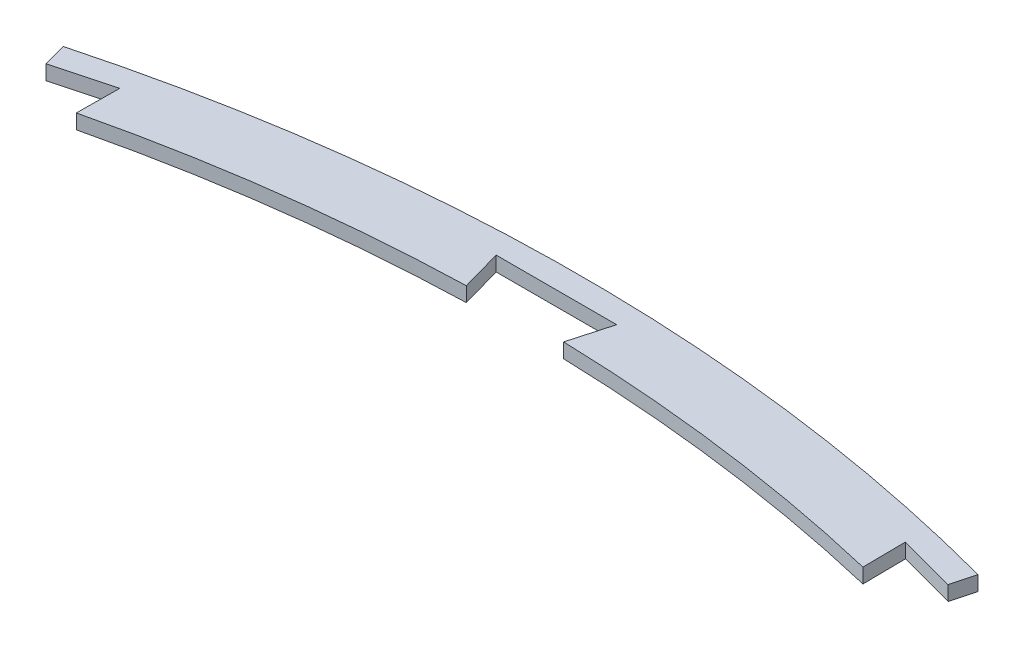
ISO-10303-21;
HEADER;
FILE_DESCRIPTION(('STEP AP214'),'2;1');
FILE_NAME('part.step','',(''),(''),'','','');
FILE_SCHEMA(('AUTOMOTIVE_DESIGN { 1 0 10303 214 1 1 1 1 }'));
ENDSEC;
DATA;
#1=APPLICATION_CONTEXT('core data for automotive mechanical design processes');
#2=APPLICATION_PROTOCOL_DEFINITION('international standard','automotive_design',2000,#1);
#3=PRODUCT_CONTEXT('',#1,'mechanical');
#4=PRODUCT('Part','Part','',(#3));
#5=PRODUCT_RELATED_PRODUCT_CATEGORY('part','',(#4));
#6=PRODUCT_DEFINITION_FORMATION('','',#4);
#7=PRODUCT_DEFINITION_CONTEXT('part definition',#1,'design');
#8=PRODUCT_DEFINITION('design','',#6,#7);
#9=PRODUCT_DEFINITION_SHAPE('','',#8);
#10=(LENGTH_UNIT() NAMED_UNIT(*) SI_UNIT(.MILLI.,.METRE.));
#11=(NAMED_UNIT(*) PLANE_ANGLE_UNIT() SI_UNIT($,.RADIAN.));
#12=(NAMED_UNIT(*) SI_UNIT($,.STERADIAN.) SOLID_ANGLE_UNIT());
#13=UNCERTAINTY_MEASURE_WITH_UNIT(LENGTH_MEASURE(1.E-05),#10,'distance_accuracy_value','');
#14=(GEOMETRIC_REPRESENTATION_CONTEXT(3) GLOBAL_UNCERTAINTY_ASSIGNED_CONTEXT((#13)) GLOBAL_UNIT_ASSIGNED_CONTEXT((#10,
#11,#12)) REPRESENTATION_CONTEXT('',''));
#15=CARTESIAN_POINT('',(0.,0.,0.));
#16=DIRECTION('',(0.,0.,1.));
#17=DIRECTION('',(1.,0.,0.));
#18=AXIS2_PLACEMENT_3D('',#15,#16,#17);
#19=CARTESIAN_POINT('',(0.,9.00000000000001,0.));
#20=DIRECTION('',(0.,-1.,0.));
#21=DIRECTION('',(0.,0.,-1.));
#22=AXIS2_PLACEMENT_3D('',#19,#20,#21);
#23=CYLINDRICAL_SURFACE('',#22,1045.);
#24=CARTESIAN_POINT('',(0.,0.,0.));
#25=DIRECTION('',(0.,1.,0.));
#26=DIRECTION('',(0.,0.,1.));
#27=AXIS2_PLACEMENT_3D('',#24,#25,#26);
#28=CIRCLE('',#27,1045.);
#29=CARTESIAN_POINT('',(241.493100980909,0.,-1016.71337267621));
#30=VERTEX_POINT('',#29);
#31=CARTESIAN_POINT('',(29.8803611509176,0.,-1044.57271839613));
#32=VERTEX_POINT('',#31);
#33=EDGE_CURVE('E176',#30,#32,#28,.T.);
#34=ORIENTED_EDGE('',*,*,#33,.F.);
#35=DIRECTION('',(0.,-1.,0.));
#36=VECTOR('',#35,1.);
#37=CARTESIAN_POINT('',(241.493100980909,9.00000000000001,-1016.71337267621));
#38=LINE('',#37,#36);
#39=CARTESIAN_POINT('',(241.493100980909,9.00000000000001,-1016.71337267621));
#40=VERTEX_POINT('',#39);
#41=EDGE_CURVE('E11',#40,#30,#38,.T.);
#42=ORIENTED_EDGE('',*,*,#41,.F.);
#43=CARTESIAN_POINT('',(0.,9.00000000000001,0.));
#44=DIRECTION('',(0.,1.,0.));
#45=DIRECTION('',(0.,0.,1.));
#46=AXIS2_PLACEMENT_3D('',#43,#44,#45);
#47=CIRCLE('',#46,1045.);
#48=CARTESIAN_POINT('',(29.8803611509176,9.00000000000001,-1044.57271839613));
#49=VERTEX_POINT('',#48);
#50=EDGE_CURVE('E170',#40,#49,#47,.T.);
#51=ORIENTED_EDGE('',*,*,#50,.T.);
#52=DIRECTION('',(0.,-1.,0.));
#53=VECTOR('',#52,1.);
#54=CARTESIAN_POINT('',(29.8803611509176,9.00000000000001,-1044.57271839613));
#55=LINE('',#54,#53);
#56=EDGE_CURVE('E113',#49,#32,#55,.T.);
#57=ORIENTED_EDGE('',*,*,#56,.T.);
#58=EDGE_LOOP('',(#34,#42,#51,#57));
#59=FACE_BOUND('',#58,.T.);
#60=ADVANCED_FACE('F49',(#59),#23,.F.);
#61=CARTESIAN_POINT('',(252.85846507014,9.00000000000001,-2.83448897572192));
#62=DIRECTION('',(0.999937176283208,0.,-0.0112090805494807));
#63=DIRECTION('',(-0.0112090805494807,0.,-0.999937176283208));
#64=AXIS2_PLACEMENT_3D('',#61,#62,#63);
#65=PLANE('',#64);
#66=DIRECTION('',(0.0112090805494807,0.,0.999937176283208));
#67=VECTOR('',#66,1.);
#68=CARTESIAN_POINT('',(252.85846507014,0.,-2.83448897572192));
#69=LINE('',#68,#67);
#70=CARTESIAN_POINT('',(241.197122686995,0.,-1043.1169387981));
#71=VERTEX_POINT('',#70);
#72=EDGE_CURVE('E180',#71,#30,#69,.T.);
#73=ORIENTED_EDGE('',*,*,#72,.F.);
#74=DIRECTION('',(0.,-1.,0.));
#75=VECTOR('',#74,1.);
#76=CARTESIAN_POINT('',(241.197122686995,9.00000000000001,-1043.1169387981));
#77=LINE('',#76,#75);
#78=CARTESIAN_POINT('',(241.197122686995,9.00000000000001,-1043.1169387981));
#79=VERTEX_POINT('',#78);
#80=EDGE_CURVE('E59',#79,#71,#77,.T.);
#81=ORIENTED_EDGE('',*,*,#80,.F.);
#82=DIRECTION('',(0.0112090805494807,0.,0.999937176283208));
#83=VECTOR('',#82,1.);
#84=CARTESIAN_POINT('',(252.85846507014,9.00000000000001,-2.83448897572192));
#85=LINE('',#84,#83);
#86=EDGE_CURVE('E297',#79,#40,#85,.T.);
#87=ORIENTED_EDGE('',*,*,#86,.T.);
#88=ORIENTED_EDGE('',*,*,#41,.T.);
#89=EDGE_LOOP('',(#73,#81,#87,#88));
#90=FACE_BOUND('',#89,.T.);
#91=ADVANCED_FACE('F51',(#90),#65,.T.);
#92=CARTESIAN_POINT('',(276.936378259693,9.00000000000001,-1033.5406341293));
#93=DIRECTION('',(-0.258819045102516,0.,0.965925826289069));
#94=DIRECTION('',(0.965925826289069,0.,0.258819045102516));
#95=AXIS2_PLACEMENT_3D('',#92,#93,#94);
#96=PLANE('',#95);
#97=DIRECTION('',(-0.965925826289069,0.,-0.258819045102516));
#98=VECTOR('',#97,1.);
#99=CARTESIAN_POINT('',(276.936378259693,0.,-1033.5406341293));
#100=LINE('',#99,#98);
#101=CARTESIAN_POINT('',(276.936378259691,0.,-1033.5406341293));
#102=VERTEX_POINT('',#101);
#103=EDGE_CURVE('E185',#102,#71,#100,.T.);
#104=ORIENTED_EDGE('',*,*,#103,.F.);
#105=DIRECTION('',(0.,-1.,0.));
#106=VECTOR('',#105,1.);
#107=CARTESIAN_POINT('',(276.936378259691,9.00000000000001,-1033.5406341293));
#108=LINE('',#107,#106);
#109=CARTESIAN_POINT('',(276.936378259691,9.00000000000001,-1033.5406341293));
#110=VERTEX_POINT('',#109);
#111=EDGE_CURVE('E237',#110,#102,#108,.T.);
#112=ORIENTED_EDGE('',*,*,#111,.F.);
#113=DIRECTION('',(-0.965925826289069,0.,-0.258819045102516));
#114=VECTOR('',#113,1.);
#115=CARTESIAN_POINT('',(276.936378259693,9.00000000000001,-1033.5406341293));
#116=LINE('',#115,#114);
#117=EDGE_CURVE('E247',#110,#79,#116,.T.);
#118=ORIENTED_EDGE('',*,*,#117,.T.);
#119=ORIENTED_EDGE('',*,*,#80,.T.);
#120=EDGE_LOOP('',(#104,#112,#118,#119));
#121=FACE_BOUND('',#120,.T.);
#122=ADVANCED_FACE('F245',(#121),#96,.T.);
#123=CARTESIAN_POINT('',(0.,9.00000000000001,0.));
#124=DIRECTION('',(-0.96592582628907,0.,-0.258819045102515));
#125=DIRECTION('',(-0.258819045102515,0.,0.96592582628907));
#126=AXIS2_PLACEMENT_3D('',#123,#124,#125);
#127=PLANE('',#126);
#128=DIRECTION('',(0.258819045102515,0.,-0.96592582628907));
#129=VECTOR('',#128,1.);
#130=CARTESIAN_POINT('',(0.,0.,0.));
#131=LINE('',#130,#129);
#132=CARTESIAN_POINT('',(280.818663936228,0.,-1048.02952152364));
#133=VERTEX_POINT('',#132);
#134=EDGE_CURVE('E189',#102,#133,#131,.T.);
#135=ORIENTED_EDGE('',*,*,#134,.T.);
#136=DIRECTION('',(0.,-1.,0.));
#137=VECTOR('',#136,1.);
#138=CARTESIAN_POINT('',(280.818663936228,9.00000000000001,-1048.02952152364));
#139=LINE('',#138,#137);
#140=CARTESIAN_POINT('',(280.818663936228,9.00000000000001,-1048.02952152364));
#141=VERTEX_POINT('',#140);
#142=EDGE_CURVE('E233',#141,#133,#139,.T.);
#143=ORIENTED_EDGE('',*,*,#142,.F.);
#144=DIRECTION('',(0.258819045102515,0.,-0.96592582628907));
#145=VECTOR('',#144,1.);
#146=CARTESIAN_POINT('',(0.,9.00000000000001,0.));
#147=LINE('',#146,#145);
#148=EDGE_CURVE('E268',#110,#141,#147,.T.);
#149=ORIENTED_EDGE('',*,*,#148,.F.);
#150=ORIENTED_EDGE('',*,*,#111,.T.);
#151=EDGE_LOOP('',(#135,#143,#149,#150));
#152=FACE_BOUND('',#151,.T.);
#153=ADVANCED_FACE('F257',(#152),#127,.F.);
#154=CARTESIAN_POINT('',(0.,9.00000000000001,0.));
#155=DIRECTION('',(0.,-1.,0.));
#156=DIRECTION('',(0.,0.,-1.));
#157=AXIS2_PLACEMENT_3D('',#154,#155,#156);
#158=CYLINDRICAL_SURFACE('',#157,1085.);
#159=CARTESIAN_POINT('',(0.,0.,0.));
#160=DIRECTION('',(0.,1.,0.));
#161=DIRECTION('',(0.,0.,1.));
#162=AXIS2_PLACEMENT_3D('',#159,#160,#161);
#163=CIRCLE('',#162,1085.);
#164=CARTESIAN_POINT('',(-280.818663936228,0.,-1048.02952152364));
#165=VERTEX_POINT('',#164);
#166=EDGE_CURVE('E192',#133,#165,#163,.T.);
#167=ORIENTED_EDGE('',*,*,#166,.T.);
#168=DIRECTION('',(0.,-1.,0.));
#169=VECTOR('',#168,1.);
#170=CARTESIAN_POINT('',(-280.818663936228,9.00000000000001,-1048.02952152364));
#171=LINE('',#170,#169);
#172=CARTESIAN_POINT('',(-280.818663936228,9.00000000000001,-1048.02952152364));
#173=VERTEX_POINT('',#172);
#174=EDGE_CURVE('E230',#173,#165,#171,.T.);
#175=ORIENTED_EDGE('',*,*,#174,.F.);
#176=CARTESIAN_POINT('',(0.,9.00000000000001,0.));
#177=DIRECTION('',(0.,1.,0.));
#178=DIRECTION('',(0.,0.,1.));
#179=AXIS2_PLACEMENT_3D('',#176,#177,#178);
#180=CIRCLE('',#179,1085.);
#181=EDGE_CURVE('E263',#141,#173,#180,.T.);
#182=ORIENTED_EDGE('',*,*,#181,.F.);
#183=ORIENTED_EDGE('',*,*,#142,.T.);
#184=EDGE_LOOP('',(#167,#175,#182,#183));
#185=FACE_BOUND('',#184,.T.);
#186=ADVANCED_FACE('F261',(#185),#158,.T.);
#187=CARTESIAN_POINT('',(0.,9.00000000000001,0.));
#188=DIRECTION('',(-0.96592582628907,0.,0.258819045102515));
#189=DIRECTION('',(0.258819045102515,0.,0.96592582628907));
#190=AXIS2_PLACEMENT_3D('',#187,#188,#189);
#191=PLANE('',#190);
#192=DIRECTION('',(-0.258819045102515,0.,-0.96592582628907));
#193=VECTOR('',#192,1.);
#194=CARTESIAN_POINT('',(0.,0.,0.));
#195=LINE('',#194,#193);
#196=CARTESIAN_POINT('',(-276.936378259691,0.,-1033.5406341293));
#197=VERTEX_POINT('',#196);
#198=EDGE_CURVE('E196',#197,#165,#195,.T.);
#199=ORIENTED_EDGE('',*,*,#198,.F.);
#200=DIRECTION('',(0.,-1.,0.));
#201=VECTOR('',#200,1.);
#202=CARTESIAN_POINT('',(-276.936378259691,9.00000000000001,-1033.5406341293));
#203=LINE('',#202,#201);
#204=CARTESIAN_POINT('',(-276.936378259691,9.00000000000001,-1033.5406341293));
#205=VERTEX_POINT('',#204);
#206=EDGE_CURVE('E227',#205,#197,#203,.T.);
#207=ORIENTED_EDGE('',*,*,#206,.F.);
#208=DIRECTION('',(-0.258819045102515,0.,-0.96592582628907));
#209=VECTOR('',#208,1.);
#210=CARTESIAN_POINT('',(0.,9.00000000000001,0.));
#211=LINE('',#210,#209);
#212=EDGE_CURVE('E267',#205,#173,#211,.T.);
#213=ORIENTED_EDGE('',*,*,#212,.T.);
#214=ORIENTED_EDGE('',*,*,#174,.T.);
#215=EDGE_LOOP('',(#199,#207,#213,#214));
#216=FACE_BOUND('',#215,.T.);
#217=ADVANCED_FACE('F333',(#216),#191,.T.);
#218=CARTESIAN_POINT('',(-276.936378259693,9.00000000000001,-1033.5406341293));
#219=DIRECTION('',(-0.258819045102517,0.,-0.965925826289069));
#220=DIRECTION('',(-0.96592582628907,0.,0.258819045102517));
#221=AXIS2_PLACEMENT_3D('',#218,#219,#220);
#222=PLANE('',#221);
#223=DIRECTION('',(0.965925826289069,0.,-0.258819045102517));
#224=VECTOR('',#223,1.);
#225=CARTESIAN_POINT('',(-276.936378259693,0.,-1033.5406341293));
#226=LINE('',#225,#224);
#227=CARTESIAN_POINT('',(-241.197122686995,0.,-1043.1169387981));
#228=VERTEX_POINT('',#227);
#229=EDGE_CURVE('E200',#197,#228,#226,.T.);
#230=ORIENTED_EDGE('',*,*,#229,.T.);
#231=DIRECTION('',(0.,-1.,0.));
#232=VECTOR('',#231,1.);
#233=CARTESIAN_POINT('',(-241.197122686995,9.00000000000001,-1043.1169387981));
#234=LINE('',#233,#232);
#235=CARTESIAN_POINT('',(-241.197122686995,9.00000000000001,-1043.1169387981));
#236=VERTEX_POINT('',#235);
#237=EDGE_CURVE('E223',#236,#228,#234,.T.);
#238=ORIENTED_EDGE('',*,*,#237,.F.);
#239=DIRECTION('',(0.965925826289069,0.,-0.258819045102517));
#240=VECTOR('',#239,1.);
#241=CARTESIAN_POINT('',(-276.936378259693,9.00000000000001,-1033.5406341293));
#242=LINE('',#241,#240);
#243=EDGE_CURVE('E273',#205,#236,#242,.T.);
#244=ORIENTED_EDGE('',*,*,#243,.F.);
#245=ORIENTED_EDGE('',*,*,#206,.T.);
#246=EDGE_LOOP('',(#230,#238,#244,#245));
#247=FACE_BOUND('',#246,.T.);
#248=ADVANCED_FACE('F329',(#247),#222,.F.);
#249=CARTESIAN_POINT('',(-252.858465070295,9.00000000000001,-2.83448897576233));
#250=DIRECTION('',(0.999937176283206,0.,0.0112090805496334));
#251=DIRECTION('',(0.0112090805496334,0.,-0.999937176283206));
#252=AXIS2_PLACEMENT_3D('',#249,#250,#251);
#253=PLANE('',#252);
#254=DIRECTION('',(-0.0112090805496334,0.,0.999937176283206));
#255=VECTOR('',#254,1.);
#256=CARTESIAN_POINT('',(-252.858465070295,0.,-2.83448897576233));
#257=LINE('',#256,#255);
#258=CARTESIAN_POINT('',(-241.493100980909,0.,-1016.71337267621));
#259=VERTEX_POINT('',#258);
#260=EDGE_CURVE('E203',#228,#259,#257,.T.);
#261=ORIENTED_EDGE('',*,*,#260,.T.);
#262=DIRECTION('',(0.,-1.,0.));
#263=VECTOR('',#262,1.);
#264=CARTESIAN_POINT('',(-241.493100980909,9.00000000000001,-1016.71337267621));
#265=LINE('',#264,#263);
#266=CARTESIAN_POINT('',(-241.493100980909,9.00000000000001,-1016.71337267621));
#267=VERTEX_POINT('',#266);
#268=EDGE_CURVE('E220',#267,#259,#265,.T.);
#269=ORIENTED_EDGE('',*,*,#268,.F.);
#270=DIRECTION('',(-0.0112090805496334,0.,0.999937176283206));
#271=VECTOR('',#270,1.);
#272=CARTESIAN_POINT('',(-252.858465070295,9.00000000000001,-2.83448897576233));
#273=LINE('',#272,#271);
#274=EDGE_CURVE('E168',#236,#267,#273,.T.);
#275=ORIENTED_EDGE('',*,*,#274,.F.);
#276=ORIENTED_EDGE('',*,*,#237,.T.);
#277=EDGE_LOOP('',(#261,#269,#275,#276));
#278=FACE_BOUND('',#277,.T.);
#279=ADVANCED_FACE('F286',(#278),#253,.F.);
#280=CARTESIAN_POINT('',(-29.8803611509177,0.,-1044.57271839614));
#281=VERTEX_POINT('',#280);
#282=EDGE_CURVE('E181',#281,#259,#28,.T.);
#283=ORIENTED_EDGE('',*,*,#282,.F.);
#284=DIRECTION('',(0.,-1.,0.));
#285=VECTOR('',#284,1.);
#286=CARTESIAN_POINT('',(-29.8803611509177,9.00000000000001,-1044.57271839614));
#287=LINE('',#286,#285);
#288=CARTESIAN_POINT('',(-29.8803611509177,9.00000000000001,-1044.57271839614));
#289=VERTEX_POINT('',#288);
#290=EDGE_CURVE('E153',#289,#281,#287,.T.);
#291=ORIENTED_EDGE('',*,*,#290,.F.);
#292=EDGE_CURVE('E163',#289,#267,#47,.T.);
#293=ORIENTED_EDGE('',*,*,#292,.T.);
#294=ORIENTED_EDGE('',*,*,#268,.T.);
#295=EDGE_LOOP('',(#283,#291,#293,#294));
#296=FACE_BOUND('',#295,.T.);
#297=ADVANCED_FACE('F291',(#296),#23,.F.);
#298=CARTESIAN_POINT('',(243.508902077206,9.00000000000001,-68.1824925816335));
#299=DIRECTION('',(0.962964019714165,0.,-0.269629925520029));
#300=DIRECTION('',(-0.269629925520029,0.,-0.962964019714165));
#301=AXIS2_PLACEMENT_3D('',#298,#299,#300);
#302=PLANE('',#301);
#303=DIRECTION('',(0.269629925520029,0.,0.962964019714165));
#304=VECTOR('',#303,1.);
#305=CARTESIAN_POINT('',(243.508902077206,0.,-68.1824925816335));
#306=LINE('',#305,#304);
#307=CARTESIAN_POINT('',(-37.,0.,-1070.));
#308=VERTEX_POINT('',#307);
#309=EDGE_CURVE('E151',#308,#281,#306,.T.);
#310=ORIENTED_EDGE('',*,*,#309,.F.);
#311=DIRECTION('',(0.,-1.,0.));
#312=VECTOR('',#311,1.);
#313=CARTESIAN_POINT('',(-37.,9.00000000000001,-1070.));
#314=LINE('',#313,#312);
#315=CARTESIAN_POINT('',(-37.,9.00000000000001,-1070.));
#316=VERTEX_POINT('',#315);
#317=EDGE_CURVE('E145',#316,#308,#314,.T.);
#318=ORIENTED_EDGE('',*,*,#317,.F.);
#319=DIRECTION('',(0.269629925520029,0.,0.962964019714165));
#320=VECTOR('',#319,1.);
#321=CARTESIAN_POINT('',(243.508902077206,9.00000000000001,-68.1824925816335));
#322=LINE('',#321,#320);
#323=EDGE_CURVE('E149',#316,#289,#322,.T.);
#324=ORIENTED_EDGE('',*,*,#323,.T.);
#325=ORIENTED_EDGE('',*,*,#290,.T.);
#326=EDGE_LOOP('',(#310,#318,#324,#325));
#327=FACE_BOUND('',#326,.T.);
#328=ADVANCED_FACE('F147',(#327),#302,.T.);
#329=CARTESIAN_POINT('',(0.,9.00000000000001,-1070.));
#330=DIRECTION('',(0.,0.,-1.));
#331=DIRECTION('',(-1.,0.,0.));
#332=AXIS2_PLACEMENT_3D('',#329,#330,#331);
#333=PLANE('',#332);
#334=DIRECTION('',(1.,0.,0.));
#335=VECTOR('',#334,1.);
#336=CARTESIAN_POINT('',(0.,0.,-1070.));
#337=LINE('',#336,#335);
#338=CARTESIAN_POINT('',(37.,0.,-1070.));
#339=VERTEX_POINT('',#338);
#340=EDGE_CURVE('E106',#308,#339,#337,.T.);
#341=ORIENTED_EDGE('',*,*,#340,.T.);
#342=DIRECTION('',(0.,-1.,0.));
#343=VECTOR('',#342,1.);
#344=CARTESIAN_POINT('',(37.,9.00000000000001,-1070.));
#345=LINE('',#344,#343);
#346=CARTESIAN_POINT('',(37.,9.00000000000001,-1070.));
#347=VERTEX_POINT('',#346);
#348=EDGE_CURVE('E154',#347,#339,#345,.T.);
#349=ORIENTED_EDGE('',*,*,#348,.F.);
#350=DIRECTION('',(1.,0.,0.));
#351=VECTOR('',#350,1.);
#352=CARTESIAN_POINT('',(0.,9.00000000000001,-1070.));
#353=LINE('',#352,#351);
#354=EDGE_CURVE('E156',#316,#347,#353,.T.);
#355=ORIENTED_EDGE('',*,*,#354,.F.);
#356=ORIENTED_EDGE('',*,*,#317,.T.);
#357=EDGE_LOOP('',(#341,#349,#355,#356));
#358=FACE_BOUND('',#357,.T.);
#359=ADVANCED_FACE('F157',(#358),#333,.F.);
#360=CARTESIAN_POINT('',(-243.508902077152,9.00000000000001,-68.182492581603));
#361=DIRECTION('',(0.962964019714181,0.,0.269629925519972));
#362=DIRECTION('',(0.269629925519972,0.,-0.962964019714182));
#363=AXIS2_PLACEMENT_3D('',#360,#361,#362);
#364=PLANE('',#363);
#365=DIRECTION('',(-0.269629925519972,0.,0.962964019714182));
#366=VECTOR('',#365,1.);
#367=CARTESIAN_POINT('',(-243.508902077152,0.,-68.182492581603));
#368=LINE('',#367,#366);
#369=EDGE_CURVE('E211',#339,#32,#368,.T.);
#370=ORIENTED_EDGE('',*,*,#369,.T.);
#371=ORIENTED_EDGE('',*,*,#56,.F.);
#372=DIRECTION('',(-0.269629925519972,0.,0.962964019714182));
#373=VECTOR('',#372,1.);
#374=CARTESIAN_POINT('',(-243.508902077152,9.00000000000001,-68.182492581603));
#375=LINE('',#374,#373);
#376=EDGE_CURVE('E67',#347,#49,#375,.T.);
#377=ORIENTED_EDGE('',*,*,#376,.F.);
#378=ORIENTED_EDGE('',*,*,#348,.T.);
#379=EDGE_LOOP('',(#370,#371,#377,#378));
#380=FACE_BOUND('',#379,.T.);
#381=ADVANCED_FACE('F295',(#380),#364,.F.);
#382=CARTESIAN_POINT('',(0.,9.00000000000001,0.));
#383=DIRECTION('',(0.,1.,0.));
#384=DIRECTION('',(0.,0.,1.));
#385=AXIS2_PLACEMENT_3D('',#382,#383,#384);
#386=PLANE('',#385);
#387=ORIENTED_EDGE('',*,*,#50,.F.);
#388=ORIENTED_EDGE('',*,*,#86,.F.);
#389=ORIENTED_EDGE('',*,*,#117,.F.);
#390=ORIENTED_EDGE('',*,*,#148,.T.);
#391=ORIENTED_EDGE('',*,*,#181,.T.);
#392=ORIENTED_EDGE('',*,*,#212,.F.);
#393=ORIENTED_EDGE('',*,*,#243,.T.);
#394=ORIENTED_EDGE('',*,*,#274,.T.);
#395=ORIENTED_EDGE('',*,*,#292,.F.);
#396=ORIENTED_EDGE('',*,*,#323,.F.);
#397=ORIENTED_EDGE('',*,*,#354,.T.);
#398=ORIENTED_EDGE('',*,*,#376,.T.);
#399=EDGE_LOOP('',(#387,#388,#389,#390,#391,#392,#393,#394,#395,#396,#397,#398));
#400=FACE_BOUND('',#399,.T.);
#401=ADVANCED_FACE('F161',(#400),#386,.T.);
#402=CARTESIAN_POINT('',(0.,0.,0.));
#403=DIRECTION('',(0.,1.,0.));
#404=DIRECTION('',(0.,0.,1.));
#405=AXIS2_PLACEMENT_3D('',#402,#403,#404);
#406=PLANE('',#405);
#407=ORIENTED_EDGE('',*,*,#33,.T.);
#408=ORIENTED_EDGE('',*,*,#369,.F.);
#409=ORIENTED_EDGE('',*,*,#340,.F.);
#410=ORIENTED_EDGE('',*,*,#309,.T.);
#411=ORIENTED_EDGE('',*,*,#282,.T.);
#412=ORIENTED_EDGE('',*,*,#260,.F.);
#413=ORIENTED_EDGE('',*,*,#229,.F.);
#414=ORIENTED_EDGE('',*,*,#198,.T.);
#415=ORIENTED_EDGE('',*,*,#166,.F.);
#416=ORIENTED_EDGE('',*,*,#134,.F.);
#417=ORIENTED_EDGE('',*,*,#103,.T.);
#418=ORIENTED_EDGE('',*,*,#72,.T.);
#419=EDGE_LOOP('',(#407,#408,#409,#410,#411,#412,#413,#414,#415,#416,#417,#418));
#420=FACE_BOUND('',#419,.T.);
#421=ADVANCED_FACE('F253',(#420),#406,.F.);
#422=CLOSED_SHELL('',(#60,#91,#122,#153,#186,#217,#248,#279,#297,#328,#359,#381,#401,#421));
#423=MANIFOLD_SOLID_BREP('B2',#422);
#424=ADVANCED_BREP_SHAPE_REPRESENTATION('',(#18,#423),#14);
#425=SHAPE_DEFINITION_REPRESENTATION(#9,#424);
ENDSEC;
END-ISO-10303-21;
